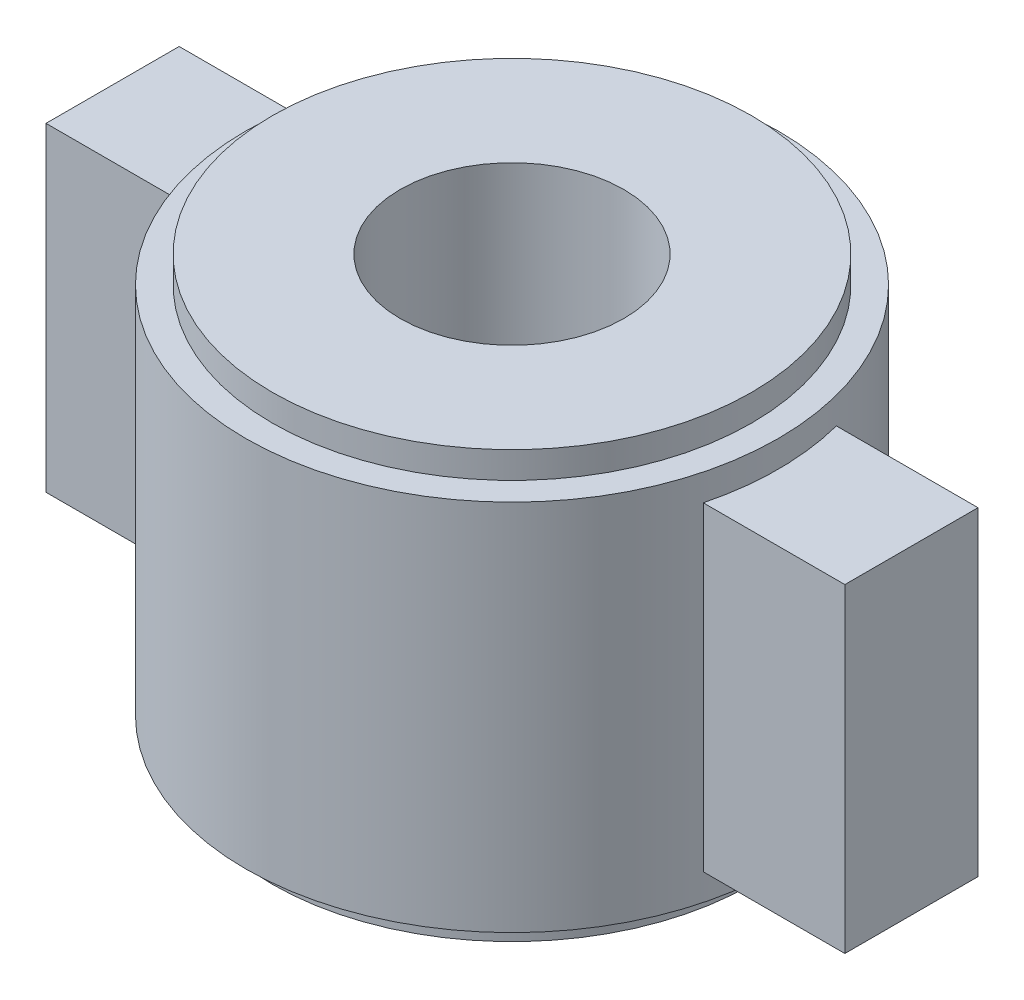
ISO-10303-21;
HEADER;
FILE_DESCRIPTION(('STEP AP214'),'2;1');
FILE_NAME('part.step','',(''),(''),'','','');
FILE_SCHEMA(('AUTOMOTIVE_DESIGN { 1 0 10303 214 1 1 1 1 }'));
ENDSEC;
DATA;
#1=APPLICATION_CONTEXT('core data for automotive mechanical design processes');
#2=APPLICATION_PROTOCOL_DEFINITION('international standard','automotive_design',2000,#1);
#3=PRODUCT_CONTEXT('',#1,'mechanical');
#4=PRODUCT('Part','Part','',(#3));
#5=PRODUCT_RELATED_PRODUCT_CATEGORY('part','',(#4));
#6=PRODUCT_DEFINITION_FORMATION('','',#4);
#7=PRODUCT_DEFINITION_CONTEXT('part definition',#1,'design');
#8=PRODUCT_DEFINITION('design','',#6,#7);
#9=PRODUCT_DEFINITION_SHAPE('','',#8);
#10=(LENGTH_UNIT() NAMED_UNIT(*) SI_UNIT(.MILLI.,.METRE.));
#11=(NAMED_UNIT(*) PLANE_ANGLE_UNIT() SI_UNIT($,.RADIAN.));
#12=(NAMED_UNIT(*) SI_UNIT($,.STERADIAN.) SOLID_ANGLE_UNIT());
#13=UNCERTAINTY_MEASURE_WITH_UNIT(LENGTH_MEASURE(1.E-05),#10,'distance_accuracy_value','');
#14=(GEOMETRIC_REPRESENTATION_CONTEXT(3) GLOBAL_UNCERTAINTY_ASSIGNED_CONTEXT((#13)) GLOBAL_UNIT_ASSIGNED_CONTEXT((#10,
#11,#12)) REPRESENTATION_CONTEXT('',''));
#15=CARTESIAN_POINT('',(0.,0.,0.));
#16=DIRECTION('',(0.,0.,1.));
#17=DIRECTION('',(1.,0.,0.));
#18=AXIS2_PLACEMENT_3D('',#15,#16,#17);
#19=CARTESIAN_POINT('',(0.,0.,0.));
#20=DIRECTION('',(0.,-1.,0.));
#21=DIRECTION('',(0.,0.,-1.));
#22=AXIS2_PLACEMENT_3D('',#19,#20,#21);
#23=CYLINDRICAL_SURFACE('',#22,10.);
#24=DIRECTION('',(0.,-1.,0.));
#25=VECTOR('',#24,1.);
#26=CARTESIAN_POINT('',(9.68245836551854,0.,2.5));
#27=LINE('',#26,#25);
#28=CARTESIAN_POINT('',(9.68245836551854,14.,2.5));
#29=VERTEX_POINT('',#28);
#30=CARTESIAN_POINT('',(9.68245836551854,2.,2.5));
#31=VERTEX_POINT('',#30);
#32=EDGE_CURVE('E11',#29,#31,#27,.T.);
#33=ORIENTED_EDGE('',*,*,#32,.F.);
#34=CARTESIAN_POINT('',(0.,14.,0.));
#35=DIRECTION('',(0.,-1.,0.));
#36=DIRECTION('',(0.,0.,-1.));
#37=AXIS2_PLACEMENT_3D('',#34,#35,#36);
#38=CIRCLE('',#37,10.);
#39=CARTESIAN_POINT('',(9.68245836551854,14.,-2.5));
#40=VERTEX_POINT('',#39);
#41=EDGE_CURVE('E188',#29,#40,#38,.F.);
#42=ORIENTED_EDGE('',*,*,#41,.T.);
#43=DIRECTION('',(0.,-1.,0.));
#44=VECTOR('',#43,1.);
#45=CARTESIAN_POINT('',(9.68245836551854,0.,-2.5));
#46=LINE('',#45,#44);
#47=CARTESIAN_POINT('',(9.68245836551854,2.,-2.5));
#48=VERTEX_POINT('',#47);
#49=EDGE_CURVE('E185',#40,#48,#46,.T.);
#50=ORIENTED_EDGE('',*,*,#49,.T.);
#51=CARTESIAN_POINT('',(0.,2.,0.));
#52=DIRECTION('',(0.,1.,0.));
#53=DIRECTION('',(0.,0.,1.));
#54=AXIS2_PLACEMENT_3D('',#51,#52,#53);
#55=CIRCLE('',#54,10.);
#56=EDGE_CURVE('E47',#48,#31,#55,.F.);
#57=ORIENTED_EDGE('',*,*,#56,.T.);
#58=EDGE_LOOP('',(#33,#42,#50,#57));
#59=FACE_BOUND('',#58,.T.);
#60=CARTESIAN_POINT('',(0.,15.,0.));
#61=DIRECTION('',(0.,-1.,0.));
#62=DIRECTION('',(0.,0.,-1.));
#63=AXIS2_PLACEMENT_3D('',#60,#61,#62);
#64=CIRCLE('',#63,10.);
#65=CARTESIAN_POINT('',(0.,15.,-10.));
#66=VERTEX_POINT('',#65);
#67=EDGE_CURVE('E162',#66,#66,#64,.T.);
#68=ORIENTED_EDGE('',*,*,#67,.T.);
#69=EDGE_LOOP('',(#68));
#70=FACE_BOUND('',#69,.T.);
#71=CARTESIAN_POINT('',(0.,1.,0.));
#72=DIRECTION('',(0.,-1.,0.));
#73=DIRECTION('',(0.,0.,-1.));
#74=AXIS2_PLACEMENT_3D('',#71,#72,#73);
#75=CIRCLE('',#74,10.);
#76=CARTESIAN_POINT('',(0.,1.,-10.));
#77=VERTEX_POINT('',#76);
#78=EDGE_CURVE('E165',#77,#77,#75,.T.);
#79=ORIENTED_EDGE('',*,*,#78,.F.);
#80=EDGE_LOOP('',(#79));
#81=FACE_BOUND('',#80,.T.);
#82=CARTESIAN_POINT('',(0.,14.,0.));
#83=DIRECTION('',(0.,-1.,0.));
#84=DIRECTION('',(0.,0.,-1.));
#85=AXIS2_PLACEMENT_3D('',#82,#83,#84);
#86=CIRCLE('',#85,10.);
#87=CARTESIAN_POINT('',(-9.68245836551854,14.,-2.5));
#88=VERTEX_POINT('',#87);
#89=CARTESIAN_POINT('',(-9.68245836551854,14.,2.5));
#90=VERTEX_POINT('',#89);
#91=EDGE_CURVE('E62',#88,#90,#86,.F.);
#92=ORIENTED_EDGE('',*,*,#91,.T.);
#93=DIRECTION('',(0.,-1.,0.));
#94=VECTOR('',#93,1.);
#95=CARTESIAN_POINT('',(-9.68245836551854,0.,2.5));
#96=LINE('',#95,#94);
#97=CARTESIAN_POINT('',(-9.68245836551854,2.,2.5));
#98=VERTEX_POINT('',#97);
#99=EDGE_CURVE('E183',#90,#98,#96,.T.);
#100=ORIENTED_EDGE('',*,*,#99,.T.);
#101=CARTESIAN_POINT('',(0.,2.,0.));
#102=DIRECTION('',(0.,1.,0.));
#103=DIRECTION('',(0.,0.,1.));
#104=AXIS2_PLACEMENT_3D('',#101,#102,#103);
#105=CIRCLE('',#104,10.);
#106=CARTESIAN_POINT('',(-9.68245836551854,2.,-2.5));
#107=VERTEX_POINT('',#106);
#108=EDGE_CURVE('E180',#98,#107,#105,.F.);
#109=ORIENTED_EDGE('',*,*,#108,.T.);
#110=DIRECTION('',(0.,-1.,0.));
#111=VECTOR('',#110,1.);
#112=CARTESIAN_POINT('',(-9.68245836551854,0.,-2.5));
#113=LINE('',#112,#111);
#114=EDGE_CURVE('E177',#88,#107,#113,.T.);
#115=ORIENTED_EDGE('',*,*,#114,.F.);
#116=EDGE_LOOP('',(#92,#100,#109,#115));
#117=FACE_BOUND('',#116,.T.);
#118=ADVANCED_FACE('F39',(#59,#70,#81,#117),#23,.T.);
#119=CARTESIAN_POINT('',(0.,0.,0.));
#120=DIRECTION('',(0.,-1.,0.));
#121=DIRECTION('',(0.,0.,-1.));
#122=AXIS2_PLACEMENT_3D('',#119,#120,#121);
#123=CYLINDRICAL_SURFACE('',#122,4.2);
#124=CARTESIAN_POINT('',(0.,0.,0.));
#125=DIRECTION('',(0.,-1.,0.));
#126=DIRECTION('',(0.,0.,-1.));
#127=AXIS2_PLACEMENT_3D('',#124,#125,#126);
#128=CIRCLE('',#127,4.2);
#129=CARTESIAN_POINT('',(0.,0.,-4.2));
#130=VERTEX_POINT('',#129);
#131=EDGE_CURVE('E174',#130,#130,#128,.T.);
#132=ORIENTED_EDGE('',*,*,#131,.T.);
#133=EDGE_LOOP('',(#132));
#134=FACE_BOUND('',#133,.T.);
#135=CARTESIAN_POINT('',(0.,16.,0.));
#136=DIRECTION('',(0.,-1.,0.));
#137=DIRECTION('',(0.,0.,-1.));
#138=AXIS2_PLACEMENT_3D('',#135,#136,#137);
#139=CIRCLE('',#138,4.2);
#140=CARTESIAN_POINT('',(0.,16.,-4.2));
#141=VERTEX_POINT('',#140);
#142=EDGE_CURVE('E153',#141,#141,#139,.T.);
#143=ORIENTED_EDGE('',*,*,#142,.F.);
#144=EDGE_LOOP('',(#143));
#145=FACE_BOUND('',#144,.T.);
#146=ADVANCED_FACE('F41',(#134,#145),#123,.F.);
#147=CARTESIAN_POINT('',(4.2,0.,0.));
#148=DIRECTION('',(0.,-1.,0.));
#149=DIRECTION('',(0.,0.,-1.));
#150=AXIS2_PLACEMENT_3D('',#147,#148,#149);
#151=PLANE('',#150);
#152=CARTESIAN_POINT('',(0.,0.,0.));
#153=DIRECTION('',(0.,-1.,0.));
#154=DIRECTION('',(0.,0.,-1.));
#155=AXIS2_PLACEMENT_3D('',#152,#153,#154);
#156=CIRCLE('',#155,9.);
#157=CARTESIAN_POINT('',(0.,0.,-9.));
#158=VERTEX_POINT('',#157);
#159=EDGE_CURVE('E171',#158,#158,#156,.T.);
#160=ORIENTED_EDGE('',*,*,#159,.T.);
#161=EDGE_LOOP('',(#160));
#162=FACE_BOUND('',#161,.T.);
#163=ORIENTED_EDGE('',*,*,#131,.F.);
#164=EDGE_LOOP('',(#163));
#165=FACE_BOUND('',#164,.T.);
#166=ADVANCED_FACE('F210',(#162,#165),#151,.T.);
#167=CARTESIAN_POINT('',(0.,0.,0.));
#168=DIRECTION('',(0.,-1.,0.));
#169=DIRECTION('',(0.,0.,-1.));
#170=AXIS2_PLACEMENT_3D('',#167,#168,#169);
#171=CYLINDRICAL_SURFACE('',#170,9.);
#172=CARTESIAN_POINT('',(0.,1.,0.));
#173=DIRECTION('',(0.,-1.,0.));
#174=DIRECTION('',(0.,0.,-1.));
#175=AXIS2_PLACEMENT_3D('',#172,#173,#174);
#176=CIRCLE('',#175,9.);
#177=CARTESIAN_POINT('',(0.,1.,-9.));
#178=VERTEX_POINT('',#177);
#179=EDGE_CURVE('E168',#178,#178,#176,.T.);
#180=ORIENTED_EDGE('',*,*,#179,.T.);
#181=EDGE_LOOP('',(#180));
#182=FACE_BOUND('',#181,.T.);
#183=ORIENTED_EDGE('',*,*,#159,.F.);
#184=EDGE_LOOP('',(#183));
#185=FACE_BOUND('',#184,.T.);
#186=ADVANCED_FACE('F219',(#182,#185),#171,.T.);
#187=CARTESIAN_POINT('',(9.,1.,0.));
#188=DIRECTION('',(0.,-1.,0.));
#189=DIRECTION('',(0.,0.,-1.));
#190=AXIS2_PLACEMENT_3D('',#187,#188,#189);
#191=PLANE('',#190);
#192=ORIENTED_EDGE('',*,*,#78,.T.);
#193=EDGE_LOOP('',(#192));
#194=FACE_BOUND('',#193,.T.);
#195=ORIENTED_EDGE('',*,*,#179,.F.);
#196=EDGE_LOOP('',(#195));
#197=FACE_BOUND('',#196,.T.);
#198=ADVANCED_FACE('F216',(#194,#197),#191,.T.);
#199=CARTESIAN_POINT('',(10.,15.,0.));
#200=DIRECTION('',(0.,1.,0.));
#201=DIRECTION('',(0.,0.,1.));
#202=AXIS2_PLACEMENT_3D('',#199,#200,#201);
#203=PLANE('',#202);
#204=CARTESIAN_POINT('',(0.,15.,0.));
#205=DIRECTION('',(0.,-1.,0.));
#206=DIRECTION('',(0.,0.,-1.));
#207=AXIS2_PLACEMENT_3D('',#204,#205,#206);
#208=CIRCLE('',#207,9.);
#209=CARTESIAN_POINT('',(0.,15.,-9.));
#210=VERTEX_POINT('',#209);
#211=EDGE_CURVE('E159',#210,#210,#208,.T.);
#212=ORIENTED_EDGE('',*,*,#211,.T.);
#213=EDGE_LOOP('',(#212));
#214=FACE_BOUND('',#213,.T.);
#215=ORIENTED_EDGE('',*,*,#67,.F.);
#216=EDGE_LOOP('',(#215));
#217=FACE_BOUND('',#216,.T.);
#218=ADVANCED_FACE('F214',(#214,#217),#203,.T.);
#219=CARTESIAN_POINT('',(0.,0.,0.));
#220=DIRECTION('',(0.,-1.,0.));
#221=DIRECTION('',(0.,0.,-1.));
#222=AXIS2_PLACEMENT_3D('',#219,#220,#221);
#223=CYLINDRICAL_SURFACE('',#222,9.);
#224=CARTESIAN_POINT('',(0.,16.,0.));
#225=DIRECTION('',(0.,-1.,0.));
#226=DIRECTION('',(0.,0.,-1.));
#227=AXIS2_PLACEMENT_3D('',#224,#225,#226);
#228=CIRCLE('',#227,9.);
#229=CARTESIAN_POINT('',(0.,16.,-9.));
#230=VERTEX_POINT('',#229);
#231=EDGE_CURVE('E156',#230,#230,#228,.T.);
#232=ORIENTED_EDGE('',*,*,#231,.T.);
#233=EDGE_LOOP('',(#232));
#234=FACE_BOUND('',#233,.T.);
#235=ORIENTED_EDGE('',*,*,#211,.F.);
#236=EDGE_LOOP('',(#235));
#237=FACE_BOUND('',#236,.T.);
#238=ADVANCED_FACE('F237',(#234,#237),#223,.T.);
#239=CARTESIAN_POINT('',(9.,16.,0.));
#240=DIRECTION('',(0.,1.,0.));
#241=DIRECTION('',(0.,0.,1.));
#242=AXIS2_PLACEMENT_3D('',#239,#240,#241);
#243=PLANE('',#242);
#244=ORIENTED_EDGE('',*,*,#142,.T.);
#245=EDGE_LOOP('',(#244));
#246=FACE_BOUND('',#245,.T.);
#247=ORIENTED_EDGE('',*,*,#231,.F.);
#248=EDGE_LOOP('',(#247));
#249=FACE_BOUND('',#248,.T.);
#250=ADVANCED_FACE('F233',(#246,#249),#243,.T.);
#251=CARTESIAN_POINT('',(-15.,14.,2.5));
#252=DIRECTION('',(0.,-1.,0.));
#253=DIRECTION('',(0.,0.,-1.));
#254=AXIS2_PLACEMENT_3D('',#251,#252,#253);
#255=PLANE('',#254);
#256=ORIENTED_EDGE('',*,*,#91,.F.);
#257=DIRECTION('',(-1.,0.,0.));
#258=VECTOR('',#257,1.);
#259=CARTESIAN_POINT('',(-15.,14.,-2.5));
#260=LINE('',#259,#258);
#261=CARTESIAN_POINT('',(-15.,14.,-2.5));
#262=VERTEX_POINT('',#261);
#263=EDGE_CURVE('E118',#88,#262,#260,.T.);
#264=ORIENTED_EDGE('',*,*,#263,.T.);
#265=DIRECTION('',(0.,0.,-1.));
#266=VECTOR('',#265,1.);
#267=CARTESIAN_POINT('',(-15.,14.,2.5));
#268=LINE('',#267,#266);
#269=CARTESIAN_POINT('',(-15.,14.,2.5));
#270=VERTEX_POINT('',#269);
#271=EDGE_CURVE('E150',#270,#262,#268,.T.);
#272=ORIENTED_EDGE('',*,*,#271,.F.);
#273=DIRECTION('',(-1.,0.,0.));
#274=VECTOR('',#273,1.);
#275=CARTESIAN_POINT('',(-15.,14.,2.5));
#276=LINE('',#275,#274);
#277=EDGE_CURVE('E134',#90,#270,#276,.T.);
#278=ORIENTED_EDGE('',*,*,#277,.F.);
#279=EDGE_LOOP('',(#256,#264,#272,#278));
#280=FACE_BOUND('',#279,.T.);
#281=ADVANCED_FACE('F236',(#280),#255,.F.);
#282=CARTESIAN_POINT('',(-15.,2.,2.5));
#283=DIRECTION('',(1.,0.,0.));
#284=DIRECTION('',(0.,0.,-1.));
#285=AXIS2_PLACEMENT_3D('',#282,#283,#284);
#286=PLANE('',#285);
#287=DIRECTION('',(0.,-1.,0.));
#288=VECTOR('',#287,1.);
#289=CARTESIAN_POINT('',(-15.,2.,-2.5));
#290=LINE('',#289,#288);
#291=CARTESIAN_POINT('',(-15.,2.,-2.5));
#292=VERTEX_POINT('',#291);
#293=EDGE_CURVE('E144',#262,#292,#290,.T.);
#294=ORIENTED_EDGE('',*,*,#293,.T.);
#295=DIRECTION('',(0.,0.,-1.));
#296=VECTOR('',#295,1.);
#297=CARTESIAN_POINT('',(-15.,2.,2.5));
#298=LINE('',#297,#296);
#299=CARTESIAN_POINT('',(-15.,2.,2.5));
#300=VERTEX_POINT('',#299);
#301=EDGE_CURVE('E142',#300,#292,#298,.T.);
#302=ORIENTED_EDGE('',*,*,#301,.F.);
#303=DIRECTION('',(0.,-1.,0.));
#304=VECTOR('',#303,1.);
#305=CARTESIAN_POINT('',(-15.,2.,2.5));
#306=LINE('',#305,#304);
#307=EDGE_CURVE('E136',#270,#300,#306,.T.);
#308=ORIENTED_EDGE('',*,*,#307,.F.);
#309=ORIENTED_EDGE('',*,*,#271,.T.);
#310=EDGE_LOOP('',(#294,#302,#308,#309));
#311=FACE_BOUND('',#310,.T.);
#312=ADVANCED_FACE('F271',(#311),#286,.F.);
#313=CARTESIAN_POINT('',(-8.,2.,2.5));
#314=DIRECTION('',(0.,1.,0.));
#315=DIRECTION('',(0.,0.,1.));
#316=AXIS2_PLACEMENT_3D('',#313,#314,#315);
#317=PLANE('',#316);
#318=ORIENTED_EDGE('',*,*,#108,.F.);
#319=DIRECTION('',(1.,0.,0.));
#320=VECTOR('',#319,1.);
#321=CARTESIAN_POINT('',(-8.,2.,2.5));
#322=LINE('',#321,#320);
#323=EDGE_CURVE('E139',#300,#98,#322,.T.);
#324=ORIENTED_EDGE('',*,*,#323,.F.);
#325=ORIENTED_EDGE('',*,*,#301,.T.);
#326=DIRECTION('',(1.,0.,0.));
#327=VECTOR('',#326,1.);
#328=CARTESIAN_POINT('',(-8.,2.,-2.5));
#329=LINE('',#328,#327);
#330=EDGE_CURVE('E137',#292,#107,#329,.T.);
#331=ORIENTED_EDGE('',*,*,#330,.T.);
#332=EDGE_LOOP('',(#318,#324,#325,#331));
#333=FACE_BOUND('',#332,.T.);
#334=ADVANCED_FACE('F279',(#333),#317,.F.);
#335=CARTESIAN_POINT('',(0.,0.,2.5));
#336=DIRECTION('',(0.,0.,-1.));
#337=DIRECTION('',(-1.,0.,0.));
#338=AXIS2_PLACEMENT_3D('',#335,#336,#337);
#339=PLANE('',#338);
#340=ORIENTED_EDGE('',*,*,#99,.F.);
#341=ORIENTED_EDGE('',*,*,#277,.T.);
#342=ORIENTED_EDGE('',*,*,#307,.T.);
#343=ORIENTED_EDGE('',*,*,#323,.T.);
#344=EDGE_LOOP('',(#340,#341,#342,#343));
#345=FACE_BOUND('',#344,.T.);
#346=ADVANCED_FACE('F287',(#345),#339,.F.);
#347=CARTESIAN_POINT('',(0.,0.,-2.5));
#348=DIRECTION('',(0.,0.,-1.));
#349=DIRECTION('',(-1.,0.,0.));
#350=AXIS2_PLACEMENT_3D('',#347,#348,#349);
#351=PLANE('',#350);
#352=ORIENTED_EDGE('',*,*,#263,.F.);
#353=ORIENTED_EDGE('',*,*,#114,.T.);
#354=ORIENTED_EDGE('',*,*,#330,.F.);
#355=ORIENTED_EDGE('',*,*,#293,.F.);
#356=EDGE_LOOP('',(#352,#353,#354,#355));
#357=FACE_BOUND('',#356,.T.);
#358=ADVANCED_FACE('F295',(#357),#351,.T.);
#359=CARTESIAN_POINT('',(8.,2.,2.5));
#360=DIRECTION('',(0.,1.,0.));
#361=DIRECTION('',(0.,0.,1.));
#362=AXIS2_PLACEMENT_3D('',#359,#360,#361);
#363=PLANE('',#362);
#364=ORIENTED_EDGE('',*,*,#56,.F.);
#365=DIRECTION('',(1.,0.,0.));
#366=VECTOR('',#365,1.);
#367=CARTESIAN_POINT('',(8.,2.,-2.5));
#368=LINE('',#367,#366);
#369=CARTESIAN_POINT('',(15.,2.,-2.5));
#370=VERTEX_POINT('',#369);
#371=EDGE_CURVE('E54',#48,#370,#368,.T.);
#372=ORIENTED_EDGE('',*,*,#371,.T.);
#373=DIRECTION('',(0.,0.,-1.));
#374=VECTOR('',#373,1.);
#375=CARTESIAN_POINT('',(15.,2.,2.5));
#376=LINE('',#375,#374);
#377=CARTESIAN_POINT('',(15.,2.,2.5));
#378=VERTEX_POINT('',#377);
#379=EDGE_CURVE('E115',#378,#370,#376,.T.);
#380=ORIENTED_EDGE('',*,*,#379,.F.);
#381=DIRECTION('',(1.,0.,0.));
#382=VECTOR('',#381,1.);
#383=CARTESIAN_POINT('',(8.,2.,2.5));
#384=LINE('',#383,#382);
#385=EDGE_CURVE('E102',#31,#378,#384,.T.);
#386=ORIENTED_EDGE('',*,*,#385,.F.);
#387=EDGE_LOOP('',(#364,#372,#380,#386));
#388=FACE_BOUND('',#387,.T.);
#389=ADVANCED_FACE('F116',(#388),#363,.F.);
#390=CARTESIAN_POINT('',(15.,2.,2.5));
#391=DIRECTION('',(-1.,0.,0.));
#392=DIRECTION('',(0.,0.,1.));
#393=AXIS2_PLACEMENT_3D('',#390,#391,#392);
#394=PLANE('',#393);
#395=DIRECTION('',(0.,1.,0.));
#396=VECTOR('',#395,1.);
#397=CARTESIAN_POINT('',(15.,2.,-2.5));
#398=LINE('',#397,#396);
#399=CARTESIAN_POINT('',(15.,14.,-2.5));
#400=VERTEX_POINT('',#399);
#401=EDGE_CURVE('E129',#370,#400,#398,.T.);
#402=ORIENTED_EDGE('',*,*,#401,.T.);
#403=DIRECTION('',(0.,0.,-1.));
#404=VECTOR('',#403,1.);
#405=CARTESIAN_POINT('',(15.,14.,2.5));
#406=LINE('',#405,#404);
#407=CARTESIAN_POINT('',(15.,14.,2.5));
#408=VERTEX_POINT('',#407);
#409=EDGE_CURVE('E119',#408,#400,#406,.T.);
#410=ORIENTED_EDGE('',*,*,#409,.F.);
#411=DIRECTION('',(0.,1.,0.));
#412=VECTOR('',#411,1.);
#413=CARTESIAN_POINT('',(15.,2.,2.5));
#414=LINE('',#413,#412);
#415=EDGE_CURVE('E107',#378,#408,#414,.T.);
#416=ORIENTED_EDGE('',*,*,#415,.F.);
#417=ORIENTED_EDGE('',*,*,#379,.T.);
#418=EDGE_LOOP('',(#402,#410,#416,#417));
#419=FACE_BOUND('',#418,.T.);
#420=ADVANCED_FACE('F121',(#419),#394,.F.);
#421=CARTESIAN_POINT('',(15.,14.,2.5));
#422=DIRECTION('',(0.,-1.,0.));
#423=DIRECTION('',(0.,0.,-1.));
#424=AXIS2_PLACEMENT_3D('',#421,#422,#423);
#425=PLANE('',#424);
#426=ORIENTED_EDGE('',*,*,#41,.F.);
#427=DIRECTION('',(-1.,0.,0.));
#428=VECTOR('',#427,1.);
#429=CARTESIAN_POINT('',(15.,14.,2.5));
#430=LINE('',#429,#428);
#431=EDGE_CURVE('E124',#408,#29,#430,.T.);
#432=ORIENTED_EDGE('',*,*,#431,.F.);
#433=ORIENTED_EDGE('',*,*,#409,.T.);
#434=DIRECTION('',(-1.,0.,0.));
#435=VECTOR('',#434,1.);
#436=CARTESIAN_POINT('',(15.,14.,-2.5));
#437=LINE('',#436,#435);
#438=EDGE_CURVE('E112',#400,#40,#437,.T.);
#439=ORIENTED_EDGE('',*,*,#438,.T.);
#440=EDGE_LOOP('',(#426,#432,#433,#439));
#441=FACE_BOUND('',#440,.T.);
#442=ADVANCED_FACE('F195',(#441),#425,.F.);
#443=CARTESIAN_POINT('',(0.,0.,2.5));
#444=DIRECTION('',(0.,0.,1.));
#445=DIRECTION('',(1.,0.,0.));
#446=AXIS2_PLACEMENT_3D('',#443,#444,#445);
#447=PLANE('',#446);
#448=ORIENTED_EDGE('',*,*,#431,.T.);
#449=ORIENTED_EDGE('',*,*,#32,.T.);
#450=ORIENTED_EDGE('',*,*,#385,.T.);
#451=ORIENTED_EDGE('',*,*,#415,.T.);
#452=EDGE_LOOP('',(#448,#449,#450,#451));
#453=FACE_BOUND('',#452,.T.);
#454=ADVANCED_FACE('F105',(#453),#447,.T.);
#455=CARTESIAN_POINT('',(0.,0.,-2.5));
#456=DIRECTION('',(0.,0.,1.));
#457=DIRECTION('',(1.,0.,0.));
#458=AXIS2_PLACEMENT_3D('',#455,#456,#457);
#459=PLANE('',#458);
#460=ORIENTED_EDGE('',*,*,#49,.F.);
#461=ORIENTED_EDGE('',*,*,#438,.F.);
#462=ORIENTED_EDGE('',*,*,#401,.F.);
#463=ORIENTED_EDGE('',*,*,#371,.F.);
#464=EDGE_LOOP('',(#460,#461,#462,#463));
#465=FACE_BOUND('',#464,.T.);
#466=ADVANCED_FACE('F193',(#465),#459,.F.);
#467=CLOSED_SHELL('',(#118,#146,#166,#186,#198,#218,#238,#250,#281,#312,#334,#346,#358,#389,
#420,#442,#454,#466));
#468=MANIFOLD_SOLID_BREP('B2',#467);
#469=ADVANCED_BREP_SHAPE_REPRESENTATION('',(#18,#468),#14);
#470=SHAPE_DEFINITION_REPRESENTATION(#9,#469);
ENDSEC;
END-ISO-10303-21;
